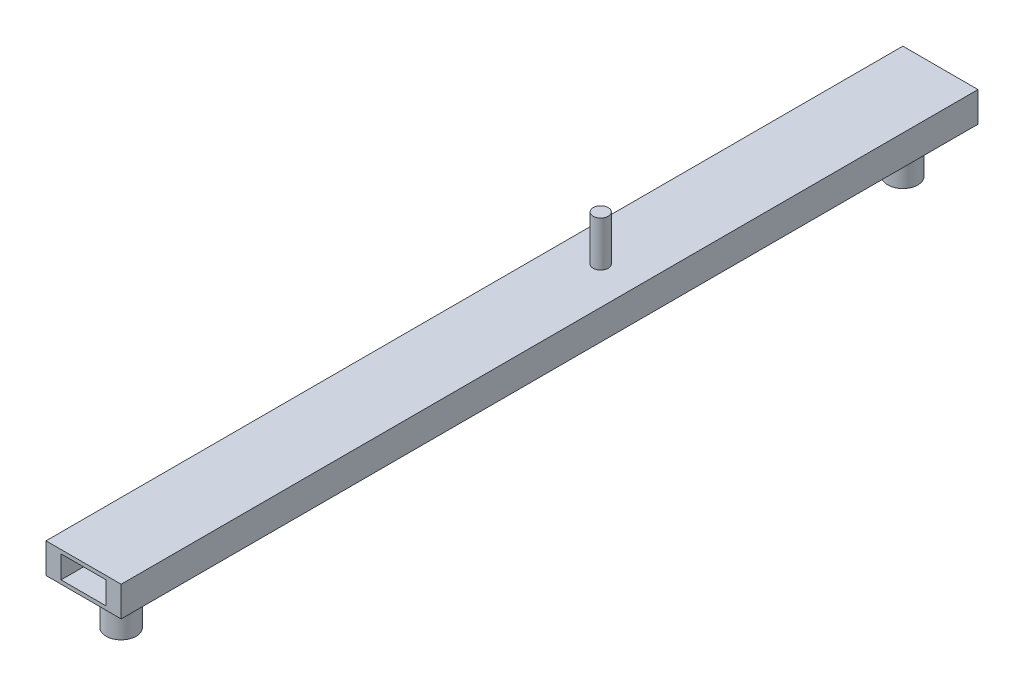
ISO-10303-21;
HEADER;
FILE_DESCRIPTION(('STEP AP214'),'2;1');
FILE_NAME('part.step','',(''),(''),'','','');
FILE_SCHEMA(('AUTOMOTIVE_DESIGN { 1 0 10303 214 1 1 1 1 }'));
ENDSEC;
DATA;
#1=APPLICATION_CONTEXT('core data for automotive mechanical design processes');
#2=APPLICATION_PROTOCOL_DEFINITION('international standard','automotive_design',2000,#1);
#3=PRODUCT_CONTEXT('',#1,'mechanical');
#4=PRODUCT('Part','Part','',(#3));
#5=PRODUCT_RELATED_PRODUCT_CATEGORY('part','',(#4));
#6=PRODUCT_DEFINITION_FORMATION('','',#4);
#7=PRODUCT_DEFINITION_CONTEXT('part definition',#1,'design');
#8=PRODUCT_DEFINITION('design','',#6,#7);
#9=PRODUCT_DEFINITION_SHAPE('','',#8);
#10=(LENGTH_UNIT() NAMED_UNIT(*) SI_UNIT(.MILLI.,.METRE.));
#11=(NAMED_UNIT(*) PLANE_ANGLE_UNIT() SI_UNIT($,.RADIAN.));
#12=(NAMED_UNIT(*) SI_UNIT($,.STERADIAN.) SOLID_ANGLE_UNIT());
#13=UNCERTAINTY_MEASURE_WITH_UNIT(LENGTH_MEASURE(1.E-05),#10,'distance_accuracy_value','');
#14=(GEOMETRIC_REPRESENTATION_CONTEXT(3) GLOBAL_UNCERTAINTY_ASSIGNED_CONTEXT((#13)) GLOBAL_UNIT_ASSIGNED_CONTEXT((#10,
#11,#12)) REPRESENTATION_CONTEXT('',''));
#15=CARTESIAN_POINT('',(0.,0.,0.));
#16=DIRECTION('',(0.,0.,1.));
#17=DIRECTION('',(1.,0.,0.));
#18=AXIS2_PLACEMENT_3D('',#15,#16,#17);
#19=CARTESIAN_POINT('',(0.,0.,285.));
#20=DIRECTION('',(0.,0.,-1.));
#21=DIRECTION('',(-1.,0.,0.));
#22=AXIS2_PLACEMENT_3D('',#19,#20,#21);
#23=PLANE('',#22);
#24=DIRECTION('',(0.,1.,0.));
#25=VECTOR('',#24,1.);
#26=CARTESIAN_POINT('',(25.,-10.,285.));
#27=LINE('',#26,#25);
#28=CARTESIAN_POINT('',(25.,-10.,285.));
#29=VERTEX_POINT('',#28);
#30=CARTESIAN_POINT('',(25.,10.,285.));
#31=VERTEX_POINT('',#30);
#32=EDGE_CURVE('E155',#29,#31,#27,.T.);
#33=ORIENTED_EDGE('',*,*,#32,.T.);
#34=DIRECTION('',(-1.,0.,0.));
#35=VECTOR('',#34,1.);
#36=CARTESIAN_POINT('',(-25.,10.,285.));
#37=LINE('',#36,#35);
#38=CARTESIAN_POINT('',(-25.,10.,285.));
#39=VERTEX_POINT('',#38);
#40=EDGE_CURVE('E159',#31,#39,#37,.T.);
#41=ORIENTED_EDGE('',*,*,#40,.T.);
#42=DIRECTION('',(0.,-1.,0.));
#43=VECTOR('',#42,1.);
#44=CARTESIAN_POINT('',(-25.,-10.,285.));
#45=LINE('',#44,#43);
#46=CARTESIAN_POINT('',(-25.,-10.,285.));
#47=VERTEX_POINT('',#46);
#48=EDGE_CURVE('E163',#39,#47,#45,.T.);
#49=ORIENTED_EDGE('',*,*,#48,.T.);
#50=DIRECTION('',(1.,0.,0.));
#51=VECTOR('',#50,1.);
#52=CARTESIAN_POINT('',(-25.,-10.,285.));
#53=LINE('',#52,#51);
#54=EDGE_CURVE('E166',#47,#29,#53,.T.);
#55=ORIENTED_EDGE('',*,*,#54,.T.);
#56=EDGE_LOOP('',(#33,#41,#49,#55));
#57=FACE_BOUND('',#56,.T.);
#58=DIRECTION('',(0.,1.,0.));
#59=VECTOR('',#58,1.);
#60=CARTESIAN_POINT('',(15.,-7.5,285.));
#61=LINE('',#60,#59);
#62=CARTESIAN_POINT('',(15.,-7.5,285.));
#63=VERTEX_POINT('',#62);
#64=CARTESIAN_POINT('',(15.,7.5,285.));
#65=VERTEX_POINT('',#64);
#66=EDGE_CURVE('E105',#63,#65,#61,.T.);
#67=ORIENTED_EDGE('',*,*,#66,.F.);
#68=DIRECTION('',(1.,0.,0.));
#69=VECTOR('',#68,1.);
#70=CARTESIAN_POINT('',(-15.,-7.5,285.));
#71=LINE('',#70,#69);
#72=CARTESIAN_POINT('',(-15.,-7.5,285.));
#73=VERTEX_POINT('',#72);
#74=EDGE_CURVE('E131',#73,#63,#71,.T.);
#75=ORIENTED_EDGE('',*,*,#74,.F.);
#76=DIRECTION('',(0.,-1.,0.));
#77=VECTOR('',#76,1.);
#78=CARTESIAN_POINT('',(-15.,-7.5,285.));
#79=LINE('',#78,#77);
#80=CARTESIAN_POINT('',(-15.,7.5,285.));
#81=VERTEX_POINT('',#80);
#82=EDGE_CURVE('E127',#81,#73,#79,.T.);
#83=ORIENTED_EDGE('',*,*,#82,.F.);
#84=DIRECTION('',(-1.,0.,0.));
#85=VECTOR('',#84,1.);
#86=CARTESIAN_POINT('',(-15.,7.5,285.));
#87=LINE('',#86,#85);
#88=EDGE_CURVE('E114',#65,#81,#87,.T.);
#89=ORIENTED_EDGE('',*,*,#88,.F.);
#90=EDGE_LOOP('',(#67,#75,#83,#89));
#91=FACE_BOUND('',#90,.T.);
#92=ADVANCED_FACE('F39',(#57,#91),#23,.F.);
#93=CARTESIAN_POINT('',(0.,0.,-285.));
#94=DIRECTION('',(0.,0.,-1.));
#95=DIRECTION('',(-1.,0.,0.));
#96=AXIS2_PLACEMENT_3D('',#93,#94,#95);
#97=PLANE('',#96);
#98=DIRECTION('',(0.,1.,0.));
#99=VECTOR('',#98,1.);
#100=CARTESIAN_POINT('',(25.,-10.,-285.));
#101=LINE('',#100,#99);
#102=CARTESIAN_POINT('',(25.,-10.,-285.));
#103=VERTEX_POINT('',#102);
#104=CARTESIAN_POINT('',(25.,10.,-285.));
#105=VERTEX_POINT('',#104);
#106=EDGE_CURVE('E123',#103,#105,#101,.T.);
#107=ORIENTED_EDGE('',*,*,#106,.F.);
#108=DIRECTION('',(1.,0.,0.));
#109=VECTOR('',#108,1.);
#110=CARTESIAN_POINT('',(-25.,-10.,-285.));
#111=LINE('',#110,#109);
#112=CARTESIAN_POINT('',(-25.,-10.,-285.));
#113=VERTEX_POINT('',#112);
#114=EDGE_CURVE('E160',#113,#103,#111,.T.);
#115=ORIENTED_EDGE('',*,*,#114,.F.);
#116=DIRECTION('',(0.,-1.,0.));
#117=VECTOR('',#116,1.);
#118=CARTESIAN_POINT('',(-25.,-10.,-285.));
#119=LINE('',#118,#117);
#120=CARTESIAN_POINT('',(-25.,10.,-285.));
#121=VERTEX_POINT('',#120);
#122=EDGE_CURVE('E176',#121,#113,#119,.T.);
#123=ORIENTED_EDGE('',*,*,#122,.F.);
#124=DIRECTION('',(-1.,0.,0.));
#125=VECTOR('',#124,1.);
#126=CARTESIAN_POINT('',(-25.,10.,-285.));
#127=LINE('',#126,#125);
#128=EDGE_CURVE('E173',#105,#121,#127,.T.);
#129=ORIENTED_EDGE('',*,*,#128,.F.);
#130=EDGE_LOOP('',(#107,#115,#123,#129));
#131=FACE_BOUND('',#130,.T.);
#132=DIRECTION('',(1.,0.,0.));
#133=VECTOR('',#132,1.);
#134=CARTESIAN_POINT('',(-15.,-7.5,-285.));
#135=LINE('',#134,#133);
#136=CARTESIAN_POINT('',(-15.,-7.5,-285.));
#137=VERTEX_POINT('',#136);
#138=CARTESIAN_POINT('',(15.,-7.5,-285.));
#139=VERTEX_POINT('',#138);
#140=EDGE_CURVE('E115',#137,#139,#135,.T.);
#141=ORIENTED_EDGE('',*,*,#140,.T.);
#142=DIRECTION('',(0.,1.,0.));
#143=VECTOR('',#142,1.);
#144=CARTESIAN_POINT('',(15.,-7.5,-285.));
#145=LINE('',#144,#143);
#146=CARTESIAN_POINT('',(15.,7.5,-285.));
#147=VERTEX_POINT('',#146);
#148=EDGE_CURVE('E63',#139,#147,#145,.T.);
#149=ORIENTED_EDGE('',*,*,#148,.T.);
#150=DIRECTION('',(-1.,0.,0.));
#151=VECTOR('',#150,1.);
#152=CARTESIAN_POINT('',(-15.,7.5,-285.));
#153=LINE('',#152,#151);
#154=CARTESIAN_POINT('',(-15.,7.5,-285.));
#155=VERTEX_POINT('',#154);
#156=EDGE_CURVE('E121',#147,#155,#153,.T.);
#157=ORIENTED_EDGE('',*,*,#156,.T.);
#158=DIRECTION('',(0.,-1.,0.));
#159=VECTOR('',#158,1.);
#160=CARTESIAN_POINT('',(-15.,-7.5,-285.));
#161=LINE('',#160,#159);
#162=EDGE_CURVE('E142',#155,#137,#161,.T.);
#163=ORIENTED_EDGE('',*,*,#162,.T.);
#164=EDGE_LOOP('',(#141,#149,#157,#163));
#165=FACE_BOUND('',#164,.T.);
#166=ADVANCED_FACE('F222',(#131,#165),#97,.T.);
#167=CARTESIAN_POINT('',(25.,-10.,285.));
#168=DIRECTION('',(-1.,0.,0.));
#169=DIRECTION('',(0.,0.,1.));
#170=AXIS2_PLACEMENT_3D('',#167,#168,#169);
#171=PLANE('',#170);
#172=ORIENTED_EDGE('',*,*,#106,.T.);
#173=DIRECTION('',(0.,0.,-1.));
#174=VECTOR('',#173,1.);
#175=CARTESIAN_POINT('',(25.,10.,285.));
#176=LINE('',#175,#174);
#177=EDGE_CURVE('E192',#31,#105,#176,.T.);
#178=ORIENTED_EDGE('',*,*,#177,.F.);
#179=ORIENTED_EDGE('',*,*,#32,.F.);
#180=DIRECTION('',(0.,0.,-1.));
#181=VECTOR('',#180,1.);
#182=CARTESIAN_POINT('',(25.,-10.,285.));
#183=LINE('',#182,#181);
#184=EDGE_CURVE('E169',#29,#103,#183,.T.);
#185=ORIENTED_EDGE('',*,*,#184,.T.);
#186=EDGE_LOOP('',(#172,#178,#179,#185));
#187=FACE_BOUND('',#186,.T.);
#188=ADVANCED_FACE('F41',(#187),#171,.F.);
#189=CARTESIAN_POINT('',(-25.,10.,285.));
#190=DIRECTION('',(0.,-1.,0.));
#191=DIRECTION('',(0.,0.,-1.));
#192=AXIS2_PLACEMENT_3D('',#189,#190,#191);
#193=PLANE('',#192);
#194=CARTESIAN_POINT('',(0.,10.,-59.));
#195=DIRECTION('',(0.,-1.,0.));
#196=DIRECTION('',(0.,0.,-1.));
#197=AXIS2_PLACEMENT_3D('',#194,#195,#196);
#198=CIRCLE('',#197,5.);
#199=CARTESIAN_POINT('',(0.,10.,-64.));
#200=VERTEX_POINT('',#199);
#201=EDGE_CURVE('E11',#200,#200,#198,.F.);
#202=ORIENTED_EDGE('',*,*,#201,.F.);
#203=EDGE_LOOP('',(#202));
#204=FACE_BOUND('',#203,.T.);
#205=ORIENTED_EDGE('',*,*,#128,.T.);
#206=DIRECTION('',(0.,0.,-1.));
#207=VECTOR('',#206,1.);
#208=CARTESIAN_POINT('',(-25.,10.,285.));
#209=LINE('',#208,#207);
#210=EDGE_CURVE('E188',#39,#121,#209,.T.);
#211=ORIENTED_EDGE('',*,*,#210,.F.);
#212=ORIENTED_EDGE('',*,*,#40,.F.);
#213=ORIENTED_EDGE('',*,*,#177,.T.);
#214=EDGE_LOOP('',(#205,#211,#212,#213));
#215=FACE_BOUND('',#214,.T.);
#216=ADVANCED_FACE('F226',(#204,#215),#193,.F.);
#217=CARTESIAN_POINT('',(-25.,-10.,285.));
#218=DIRECTION('',(1.,0.,0.));
#219=DIRECTION('',(0.,0.,-1.));
#220=AXIS2_PLACEMENT_3D('',#217,#218,#219);
#221=PLANE('',#220);
#222=ORIENTED_EDGE('',*,*,#122,.T.);
#223=DIRECTION('',(0.,0.,-1.));
#224=VECTOR('',#223,1.);
#225=CARTESIAN_POINT('',(-25.,-10.,285.));
#226=LINE('',#225,#224);
#227=EDGE_CURVE('E184',#47,#113,#226,.T.);
#228=ORIENTED_EDGE('',*,*,#227,.F.);
#229=ORIENTED_EDGE('',*,*,#48,.F.);
#230=ORIENTED_EDGE('',*,*,#210,.T.);
#231=EDGE_LOOP('',(#222,#228,#229,#230));
#232=FACE_BOUND('',#231,.T.);
#233=ADVANCED_FACE('F208',(#232),#221,.F.);
#234=CARTESIAN_POINT('',(-25.,-10.,285.));
#235=DIRECTION('',(0.,1.,0.));
#236=DIRECTION('',(0.,0.,1.));
#237=AXIS2_PLACEMENT_3D('',#234,#235,#236);
#238=PLANE('',#237);
#239=CARTESIAN_POINT('',(0.,-10.,-260.));
#240=DIRECTION('',(0.,1.,0.));
#241=DIRECTION('',(0.,0.,1.));
#242=AXIS2_PLACEMENT_3D('',#239,#240,#241);
#243=CIRCLE('',#242,10.);
#244=CARTESIAN_POINT('',(0.,-10.,-250.));
#245=VERTEX_POINT('',#244);
#246=EDGE_CURVE('E48',#245,#245,#243,.F.);
#247=ORIENTED_EDGE('',*,*,#246,.F.);
#248=EDGE_LOOP('',(#247));
#249=FACE_BOUND('',#248,.T.);
#250=CARTESIAN_POINT('',(0.,-10.,260.));
#251=DIRECTION('',(0.,1.,0.));
#252=DIRECTION('',(0.,0.,1.));
#253=AXIS2_PLACEMENT_3D('',#250,#251,#252);
#254=CIRCLE('',#253,10.);
#255=CARTESIAN_POINT('',(0.,-10.,270.));
#256=VERTEX_POINT('',#255);
#257=EDGE_CURVE('E196',#256,#256,#254,.F.);
#258=ORIENTED_EDGE('',*,*,#257,.F.);
#259=EDGE_LOOP('',(#258));
#260=FACE_BOUND('',#259,.T.);
#261=ORIENTED_EDGE('',*,*,#114,.T.);
#262=ORIENTED_EDGE('',*,*,#184,.F.);
#263=ORIENTED_EDGE('',*,*,#54,.F.);
#264=ORIENTED_EDGE('',*,*,#227,.T.);
#265=EDGE_LOOP('',(#261,#262,#263,#264));
#266=FACE_BOUND('',#265,.T.);
#267=ADVANCED_FACE('F205',(#249,#260,#266),#238,.F.);
#268=CARTESIAN_POINT('',(15.,-7.5,285.));
#269=DIRECTION('',(-1.,0.,0.));
#270=DIRECTION('',(0.,0.,1.));
#271=AXIS2_PLACEMENT_3D('',#268,#269,#270);
#272=PLANE('',#271);
#273=ORIENTED_EDGE('',*,*,#148,.F.);
#274=DIRECTION('',(0.,0.,-1.));
#275=VECTOR('',#274,1.);
#276=CARTESIAN_POINT('',(15.,-7.5,285.));
#277=LINE('',#276,#275);
#278=EDGE_CURVE('E109',#63,#139,#277,.T.);
#279=ORIENTED_EDGE('',*,*,#278,.F.);
#280=ORIENTED_EDGE('',*,*,#66,.T.);
#281=DIRECTION('',(0.,0.,-1.));
#282=VECTOR('',#281,1.);
#283=CARTESIAN_POINT('',(15.,7.5,285.));
#284=LINE('',#283,#282);
#285=EDGE_CURVE('E108',#65,#147,#284,.T.);
#286=ORIENTED_EDGE('',*,*,#285,.T.);
#287=EDGE_LOOP('',(#273,#279,#280,#286));
#288=FACE_BOUND('',#287,.T.);
#289=ADVANCED_FACE('F107',(#288),#272,.T.);
#290=CARTESIAN_POINT('',(-15.,7.5,285.));
#291=DIRECTION('',(0.,-1.,0.));
#292=DIRECTION('',(0.,0.,-1.));
#293=AXIS2_PLACEMENT_3D('',#290,#291,#292);
#294=PLANE('',#293);
#295=ORIENTED_EDGE('',*,*,#156,.F.);
#296=ORIENTED_EDGE('',*,*,#285,.F.);
#297=ORIENTED_EDGE('',*,*,#88,.T.);
#298=DIRECTION('',(0.,0.,-1.));
#299=VECTOR('',#298,1.);
#300=CARTESIAN_POINT('',(-15.,7.5,285.));
#301=LINE('',#300,#299);
#302=EDGE_CURVE('E124',#81,#155,#301,.T.);
#303=ORIENTED_EDGE('',*,*,#302,.T.);
#304=EDGE_LOOP('',(#295,#296,#297,#303));
#305=FACE_BOUND('',#304,.T.);
#306=ADVANCED_FACE('F118',(#305),#294,.T.);
#307=CARTESIAN_POINT('',(-15.,-7.5,285.));
#308=DIRECTION('',(1.,0.,0.));
#309=DIRECTION('',(0.,0.,-1.));
#310=AXIS2_PLACEMENT_3D('',#307,#308,#309);
#311=PLANE('',#310);
#312=ORIENTED_EDGE('',*,*,#162,.F.);
#313=ORIENTED_EDGE('',*,*,#302,.F.);
#314=ORIENTED_EDGE('',*,*,#82,.T.);
#315=DIRECTION('',(0.,0.,-1.));
#316=VECTOR('',#315,1.);
#317=CARTESIAN_POINT('',(-15.,-7.5,285.));
#318=LINE('',#317,#316);
#319=EDGE_CURVE('E55',#73,#137,#318,.T.);
#320=ORIENTED_EDGE('',*,*,#319,.T.);
#321=EDGE_LOOP('',(#312,#313,#314,#320));
#322=FACE_BOUND('',#321,.T.);
#323=ADVANCED_FACE('F248',(#322),#311,.T.);
#324=CARTESIAN_POINT('',(-15.,-7.5,285.));
#325=DIRECTION('',(0.,1.,0.));
#326=DIRECTION('',(0.,0.,1.));
#327=AXIS2_PLACEMENT_3D('',#324,#325,#326);
#328=PLANE('',#327);
#329=ORIENTED_EDGE('',*,*,#140,.F.);
#330=ORIENTED_EDGE('',*,*,#319,.F.);
#331=ORIENTED_EDGE('',*,*,#74,.T.);
#332=ORIENTED_EDGE('',*,*,#278,.T.);
#333=EDGE_LOOP('',(#329,#330,#331,#332));
#334=FACE_BOUND('',#333,.T.);
#335=ADVANCED_FACE('F251',(#334),#328,.T.);
#336=CARTESIAN_POINT('',(0.,-40.,260.));
#337=DIRECTION('',(0.,1.,0.));
#338=DIRECTION('',(0.,0.,1.));
#339=AXIS2_PLACEMENT_3D('',#336,#337,#338);
#340=CYLINDRICAL_SURFACE('',#339,10.);
#341=CARTESIAN_POINT('',(0.,-40.,260.));
#342=DIRECTION('',(0.,-1.,0.));
#343=DIRECTION('',(0.,0.,-1.));
#344=AXIS2_PLACEMENT_3D('',#341,#342,#343);
#345=CIRCLE('',#344,10.);
#346=CARTESIAN_POINT('',(0.,-40.,250.));
#347=VERTEX_POINT('',#346);
#348=EDGE_CURVE('E139',#347,#347,#345,.T.);
#349=ORIENTED_EDGE('',*,*,#348,.F.);
#350=EDGE_LOOP('',(#349));
#351=FACE_BOUND('',#350,.T.);
#352=ORIENTED_EDGE('',*,*,#257,.T.);
#353=EDGE_LOOP('',(#352));
#354=FACE_BOUND('',#353,.T.);
#355=ADVANCED_FACE('F255',(#351,#354),#340,.T.);
#356=CARTESIAN_POINT('',(0.,-40.,260.));
#357=DIRECTION('',(0.,-1.,0.));
#358=DIRECTION('',(0.,0.,-1.));
#359=AXIS2_PLACEMENT_3D('',#356,#357,#358);
#360=PLANE('',#359);
#361=ORIENTED_EDGE('',*,*,#348,.T.);
#362=EDGE_LOOP('',(#361));
#363=FACE_BOUND('',#362,.T.);
#364=ADVANCED_FACE('F258',(#363),#360,.T.);
#365=CARTESIAN_POINT('',(0.,-40.,-260.));
#366=DIRECTION('',(0.,1.,0.));
#367=DIRECTION('',(0.,0.,1.));
#368=AXIS2_PLACEMENT_3D('',#365,#366,#367);
#369=CYLINDRICAL_SURFACE('',#368,10.);
#370=CARTESIAN_POINT('',(0.,-40.,-260.));
#371=DIRECTION('',(0.,-1.,0.));
#372=DIRECTION('',(0.,0.,1.));
#373=AXIS2_PLACEMENT_3D('',#370,#371,#372);
#374=CIRCLE('',#373,10.);
#375=CARTESIAN_POINT('',(0.,-40.,-250.));
#376=VERTEX_POINT('',#375);
#377=EDGE_CURVE('E283',#376,#376,#374,.T.);
#378=ORIENTED_EDGE('',*,*,#377,.F.);
#379=EDGE_LOOP('',(#378));
#380=FACE_BOUND('',#379,.T.);
#381=ORIENTED_EDGE('',*,*,#246,.T.);
#382=EDGE_LOOP('',(#381));
#383=FACE_BOUND('',#382,.T.);
#384=ADVANCED_FACE('F203',(#380,#383),#369,.T.);
#385=CARTESIAN_POINT('',(0.,-40.,-260.));
#386=DIRECTION('',(0.,1.,0.));
#387=DIRECTION('',(0.,0.,1.));
#388=AXIS2_PLACEMENT_3D('',#385,#386,#387);
#389=PLANE('',#388);
#390=ORIENTED_EDGE('',*,*,#377,.T.);
#391=EDGE_LOOP('',(#390));
#392=FACE_BOUND('',#391,.T.);
#393=ADVANCED_FACE('F265',(#392),#389,.F.);
#394=CARTESIAN_POINT('',(0.,40.,-59.));
#395=DIRECTION('',(0.,-1.,0.));
#396=DIRECTION('',(0.,0.,-1.));
#397=AXIS2_PLACEMENT_3D('',#394,#395,#396);
#398=CYLINDRICAL_SURFACE('',#397,5.);
#399=CARTESIAN_POINT('',(0.,40.,-59.));
#400=DIRECTION('',(0.,1.,0.));
#401=DIRECTION('',(0.,0.,1.));
#402=AXIS2_PLACEMENT_3D('',#399,#400,#401);
#403=CIRCLE('',#402,5.);
#404=CARTESIAN_POINT('',(0.,40.,-54.));
#405=VERTEX_POINT('',#404);
#406=EDGE_CURVE('E281',#405,#405,#403,.T.);
#407=ORIENTED_EDGE('',*,*,#406,.F.);
#408=EDGE_LOOP('',(#407));
#409=FACE_BOUND('',#408,.T.);
#410=ORIENTED_EDGE('',*,*,#201,.T.);
#411=EDGE_LOOP('',(#410));
#412=FACE_BOUND('',#411,.T.);
#413=ADVANCED_FACE('F269',(#409,#412),#398,.T.);
#414=CARTESIAN_POINT('',(0.,40.,-59.));
#415=DIRECTION('',(0.,1.,0.));
#416=DIRECTION('',(0.,0.,1.));
#417=AXIS2_PLACEMENT_3D('',#414,#415,#416);
#418=PLANE('',#417);
#419=ORIENTED_EDGE('',*,*,#406,.T.);
#420=EDGE_LOOP('',(#419));
#421=FACE_BOUND('',#420,.T.);
#422=ADVANCED_FACE('F273',(#421),#418,.T.);
#423=CLOSED_SHELL('',(#92,#166,#188,#216,#233,#267,#289,#306,#323,#335,#355,#364,#384,#393,#413,#422));
#424=MANIFOLD_SOLID_BREP('B2',#423);
#425=ADVANCED_BREP_SHAPE_REPRESENTATION('',(#18,#424),#14);
#426=SHAPE_DEFINITION_REPRESENTATION(#9,#425);
ENDSEC;
END-ISO-10303-21;
